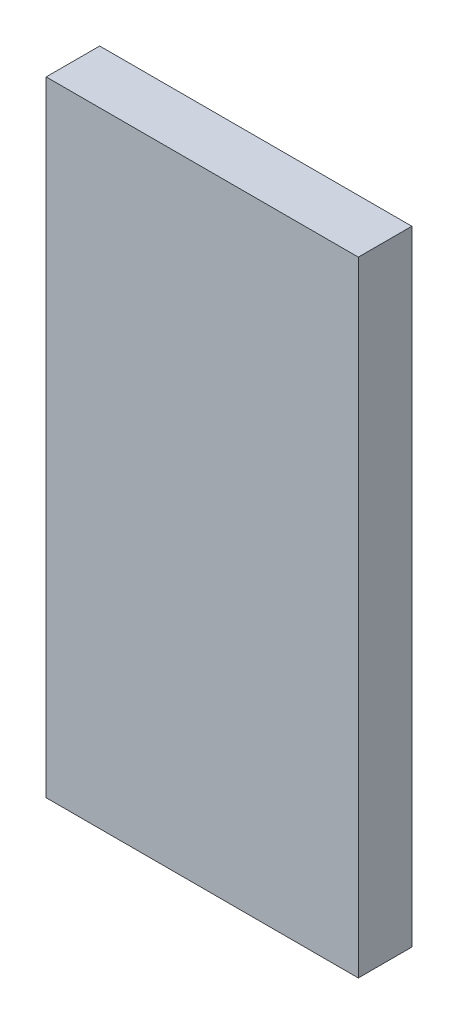
ISO-10303-21;
HEADER;
FILE_DESCRIPTION(('STEP AP214'),'2;1');
FILE_NAME('part.step','',(''),(''),'','','');
FILE_SCHEMA(('AUTOMOTIVE_DESIGN { 1 0 10303 214 1 1 1 1 }'));
ENDSEC;
DATA;
#1=APPLICATION_CONTEXT('core data for automotive mechanical design processes');
#2=APPLICATION_PROTOCOL_DEFINITION('international standard','automotive_design',2000,#1);
#3=PRODUCT_CONTEXT('',#1,'mechanical');
#4=PRODUCT('Part','Part','',(#3));
#5=PRODUCT_RELATED_PRODUCT_CATEGORY('part','',(#4));
#6=PRODUCT_DEFINITION_FORMATION('','',#4);
#7=PRODUCT_DEFINITION_CONTEXT('part definition',#1,'design');
#8=PRODUCT_DEFINITION('design','',#6,#7);
#9=PRODUCT_DEFINITION_SHAPE('','',#8);
#10=(LENGTH_UNIT() NAMED_UNIT(*) SI_UNIT(.MILLI.,.METRE.));
#11=(NAMED_UNIT(*) PLANE_ANGLE_UNIT() SI_UNIT($,.RADIAN.));
#12=(NAMED_UNIT(*) SI_UNIT($,.STERADIAN.) SOLID_ANGLE_UNIT());
#13=UNCERTAINTY_MEASURE_WITH_UNIT(LENGTH_MEASURE(1.E-05),#10,'distance_accuracy_value','');
#14=(GEOMETRIC_REPRESENTATION_CONTEXT(3) GLOBAL_UNCERTAINTY_ASSIGNED_CONTEXT((#13)) GLOBAL_UNIT_ASSIGNED_CONTEXT((#10,
#11,#12)) REPRESENTATION_CONTEXT('',''));
#15=CARTESIAN_POINT('',(0.,0.,0.));
#16=DIRECTION('',(0.,0.,1.));
#17=DIRECTION('',(1.,0.,0.));
#18=AXIS2_PLACEMENT_3D('',#15,#16,#17);
#19=CARTESIAN_POINT('',(0.,0.,6.));
#20=DIRECTION('',(1.,0.,0.));
#21=DIRECTION('',(0.,0.,-1.));
#22=AXIS2_PLACEMENT_3D('',#19,#20,#21);
#23=PLANE('',#22);
#24=DIRECTION('',(0.,-1.,0.));
#25=VECTOR('',#24,1.);
#26=CARTESIAN_POINT('',(0.,0.,0.));
#27=LINE('',#26,#25);
#28=CARTESIAN_POINT('',(0.,70.,0.));
#29=VERTEX_POINT('',#28);
#30=CARTESIAN_POINT('',(0.,0.,0.));
#31=VERTEX_POINT('',#30);
#32=EDGE_CURVE('E111',#29,#31,#27,.T.);
#33=ORIENTED_EDGE('',*,*,#32,.T.);
#34=DIRECTION('',(0.,0.,-1.));
#35=VECTOR('',#34,1.);
#36=CARTESIAN_POINT('',(0.,0.,6.));
#37=LINE('',#36,#35);
#38=CARTESIAN_POINT('',(0.,0.,6.));
#39=VERTEX_POINT('',#38);
#40=EDGE_CURVE('E11',#39,#31,#37,.T.);
#41=ORIENTED_EDGE('',*,*,#40,.F.);
#42=DIRECTION('',(0.,-1.,0.));
#43=VECTOR('',#42,1.);
#44=CARTESIAN_POINT('',(0.,0.,6.));
#45=LINE('',#44,#43);
#46=CARTESIAN_POINT('',(0.,70.,6.));
#47=VERTEX_POINT('',#46);
#48=EDGE_CURVE('E95',#47,#39,#45,.T.);
#49=ORIENTED_EDGE('',*,*,#48,.F.);
#50=DIRECTION('',(0.,0.,-1.));
#51=VECTOR('',#50,1.);
#52=CARTESIAN_POINT('',(0.,70.,6.));
#53=LINE('',#52,#51);
#54=EDGE_CURVE('E107',#47,#29,#53,.T.);
#55=ORIENTED_EDGE('',*,*,#54,.T.);
#56=EDGE_LOOP('',(#33,#41,#49,#55));
#57=FACE_BOUND('',#56,.T.);
#58=ADVANCED_FACE('F43',(#57),#23,.F.);
#59=CARTESIAN_POINT('',(0.,0.,6.));
#60=DIRECTION('',(0.,1.,0.));
#61=DIRECTION('',(0.,0.,1.));
#62=AXIS2_PLACEMENT_3D('',#59,#60,#61);
#63=PLANE('',#62);
#64=DIRECTION('',(1.,0.,0.));
#65=VECTOR('',#64,1.);
#66=CARTESIAN_POINT('',(0.,0.,0.));
#67=LINE('',#66,#65);
#68=CARTESIAN_POINT('',(35.,0.,0.));
#69=VERTEX_POINT('',#68);
#70=EDGE_CURVE('E100',#31,#69,#67,.T.);
#71=ORIENTED_EDGE('',*,*,#70,.T.);
#72=DIRECTION('',(0.,0.,-1.));
#73=VECTOR('',#72,1.);
#74=CARTESIAN_POINT('',(35.,0.,6.));
#75=LINE('',#74,#73);
#76=CARTESIAN_POINT('',(35.,0.,6.));
#77=VERTEX_POINT('',#76);
#78=EDGE_CURVE('E52',#77,#69,#75,.T.);
#79=ORIENTED_EDGE('',*,*,#78,.F.);
#80=DIRECTION('',(1.,0.,0.));
#81=VECTOR('',#80,1.);
#82=CARTESIAN_POINT('',(0.,0.,6.));
#83=LINE('',#82,#81);
#84=EDGE_CURVE('E90',#39,#77,#83,.T.);
#85=ORIENTED_EDGE('',*,*,#84,.F.);
#86=ORIENTED_EDGE('',*,*,#40,.T.);
#87=EDGE_LOOP('',(#71,#79,#85,#86));
#88=FACE_BOUND('',#87,.T.);
#89=ADVANCED_FACE('F99',(#88),#63,.F.);
#90=CARTESIAN_POINT('',(35.,0.,6.));
#91=DIRECTION('',(-1.,0.,0.));
#92=DIRECTION('',(0.,0.,1.));
#93=AXIS2_PLACEMENT_3D('',#90,#91,#92);
#94=PLANE('',#93);
#95=DIRECTION('',(0.,1.,0.));
#96=VECTOR('',#95,1.);
#97=CARTESIAN_POINT('',(35.,0.,0.));
#98=LINE('',#97,#96);
#99=CARTESIAN_POINT('',(35.,70.,0.));
#100=VERTEX_POINT('',#99);
#101=EDGE_CURVE('E77',#69,#100,#98,.T.);
#102=ORIENTED_EDGE('',*,*,#101,.T.);
#103=DIRECTION('',(0.,0.,-1.));
#104=VECTOR('',#103,1.);
#105=CARTESIAN_POINT('',(35.,70.,6.));
#106=LINE('',#105,#104);
#107=CARTESIAN_POINT('',(35.,70.,6.));
#108=VERTEX_POINT('',#107);
#109=EDGE_CURVE('E102',#108,#100,#106,.T.);
#110=ORIENTED_EDGE('',*,*,#109,.F.);
#111=DIRECTION('',(0.,1.,0.));
#112=VECTOR('',#111,1.);
#113=CARTESIAN_POINT('',(35.,0.,6.));
#114=LINE('',#113,#112);
#115=EDGE_CURVE('E93',#77,#108,#114,.T.);
#116=ORIENTED_EDGE('',*,*,#115,.F.);
#117=ORIENTED_EDGE('',*,*,#78,.T.);
#118=EDGE_LOOP('',(#102,#110,#116,#117));
#119=FACE_BOUND('',#118,.T.);
#120=ADVANCED_FACE('F103',(#119),#94,.F.);
#121=CARTESIAN_POINT('',(0.,70.,6.));
#122=DIRECTION('',(0.,-1.,0.));
#123=DIRECTION('',(0.,0.,-1.));
#124=AXIS2_PLACEMENT_3D('',#121,#122,#123);
#125=PLANE('',#124);
#126=DIRECTION('',(-1.,0.,0.));
#127=VECTOR('',#126,1.);
#128=CARTESIAN_POINT('',(0.,70.,0.));
#129=LINE('',#128,#127);
#130=EDGE_CURVE('E83',#100,#29,#129,.T.);
#131=ORIENTED_EDGE('',*,*,#130,.T.);
#132=ORIENTED_EDGE('',*,*,#54,.F.);
#133=DIRECTION('',(-1.,0.,0.));
#134=VECTOR('',#133,1.);
#135=CARTESIAN_POINT('',(0.,70.,6.));
#136=LINE('',#135,#134);
#137=EDGE_CURVE('E60',#108,#47,#136,.T.);
#138=ORIENTED_EDGE('',*,*,#137,.F.);
#139=ORIENTED_EDGE('',*,*,#109,.T.);
#140=EDGE_LOOP('',(#131,#132,#138,#139));
#141=FACE_BOUND('',#140,.T.);
#142=ADVANCED_FACE('F124',(#141),#125,.F.);
#143=CARTESIAN_POINT('',(0.,0.,6.));
#144=DIRECTION('',(0.,0.,-1.));
#145=DIRECTION('',(-1.,0.,0.));
#146=AXIS2_PLACEMENT_3D('',#143,#144,#145);
#147=PLANE('',#146);
#148=ORIENTED_EDGE('',*,*,#48,.T.);
#149=ORIENTED_EDGE('',*,*,#84,.T.);
#150=ORIENTED_EDGE('',*,*,#115,.T.);
#151=ORIENTED_EDGE('',*,*,#137,.T.);
#152=EDGE_LOOP('',(#148,#149,#150,#151));
#153=FACE_BOUND('',#152,.T.);
#154=ADVANCED_FACE('F91',(#153),#147,.F.);
#155=CARTESIAN_POINT('',(0.,0.,0.));
#156=DIRECTION('',(0.,0.,-1.));
#157=DIRECTION('',(-1.,0.,0.));
#158=AXIS2_PLACEMENT_3D('',#155,#156,#157);
#159=PLANE('',#158);
#160=ORIENTED_EDGE('',*,*,#32,.F.);
#161=ORIENTED_EDGE('',*,*,#130,.F.);
#162=ORIENTED_EDGE('',*,*,#101,.F.);
#163=ORIENTED_EDGE('',*,*,#70,.F.);
#164=EDGE_LOOP('',(#160,#161,#162,#163));
#165=FACE_BOUND('',#164,.T.);
#166=ADVANCED_FACE('F127',(#165),#159,.T.);
#167=CLOSED_SHELL('',(#58,#89,#120,#142,#154,#166));
#168=MANIFOLD_SOLID_BREP('B2',#167);
#169=ADVANCED_BREP_SHAPE_REPRESENTATION('',(#18,#168),#14);
#170=SHAPE_DEFINITION_REPRESENTATION(#9,#169);
ENDSEC;
END-ISO-10303-21;
